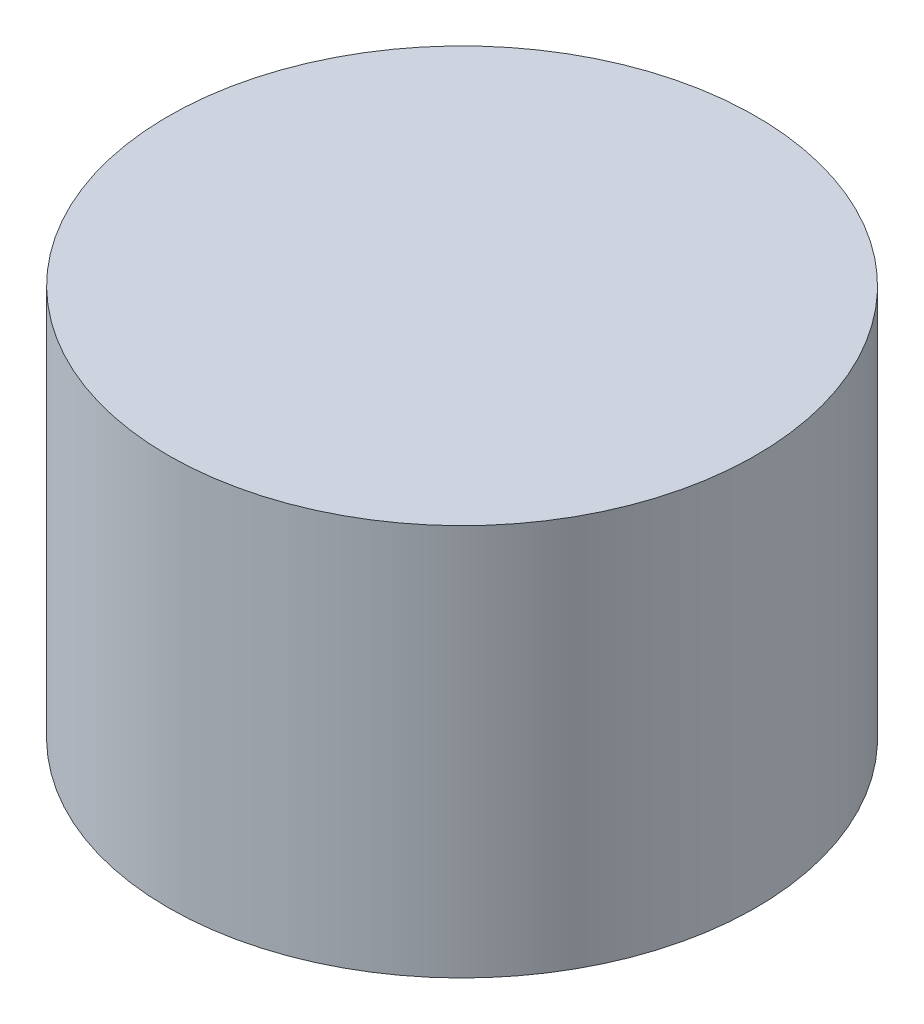
ISO-10303-21;
HEADER;
FILE_DESCRIPTION(('STEP AP214'),'2;1');
FILE_NAME('part.step','',(''),(''),'','','');
FILE_SCHEMA(('AUTOMOTIVE_DESIGN { 1 0 10303 214 1 1 1 1 }'));
ENDSEC;
DATA;
#1=APPLICATION_CONTEXT('core data for automotive mechanical design processes');
#2=APPLICATION_PROTOCOL_DEFINITION('international standard','automotive_design',2000,#1);
#3=PRODUCT_CONTEXT('',#1,'mechanical');
#4=PRODUCT('Part','Part','',(#3));
#5=PRODUCT_RELATED_PRODUCT_CATEGORY('part','',(#4));
#6=PRODUCT_DEFINITION_FORMATION('','',#4);
#7=PRODUCT_DEFINITION_CONTEXT('part definition',#1,'design');
#8=PRODUCT_DEFINITION('design','',#6,#7);
#9=PRODUCT_DEFINITION_SHAPE('','',#8);
#10=(LENGTH_UNIT() NAMED_UNIT(*) SI_UNIT(.MILLI.,.METRE.));
#11=(NAMED_UNIT(*) PLANE_ANGLE_UNIT() SI_UNIT($,.RADIAN.));
#12=(NAMED_UNIT(*) SI_UNIT($,.STERADIAN.) SOLID_ANGLE_UNIT());
#13=UNCERTAINTY_MEASURE_WITH_UNIT(LENGTH_MEASURE(1.E-05),#10,'distance_accuracy_value','');
#14=(GEOMETRIC_REPRESENTATION_CONTEXT(3) GLOBAL_UNCERTAINTY_ASSIGNED_CONTEXT((#13)) GLOBAL_UNIT_ASSIGNED_CONTEXT((#10,
#11,#12)) REPRESENTATION_CONTEXT('',''));
#15=CARTESIAN_POINT('',(0.,0.,0.));
#16=DIRECTION('',(0.,0.,1.));
#17=DIRECTION('',(1.,0.,0.));
#18=AXIS2_PLACEMENT_3D('',#15,#16,#17);
#19=CARTESIAN_POINT('',(0.,25.4,0.));
#20=DIRECTION('',(0.,-1.,0.));
#21=DIRECTION('',(0.,0.,-1.));
#22=AXIS2_PLACEMENT_3D('',#19,#20,#21);
#23=CYLINDRICAL_SURFACE('',#22,19.05);
#24=CARTESIAN_POINT('',(0.,25.4,0.));
#25=DIRECTION('',(0.,1.,0.));
#26=DIRECTION('',(0.,0.,1.));
#27=AXIS2_PLACEMENT_3D('',#24,#25,#26);
#28=CIRCLE('',#27,19.05);
#29=CARTESIAN_POINT('',(0.,25.4,19.05));
#30=VERTEX_POINT('',#29);
#31=EDGE_CURVE('E10',#30,#30,#28,.T.);
#32=ORIENTED_EDGE('',*,*,#31,.F.);
#33=EDGE_LOOP('',(#32));
#34=FACE_BOUND('',#33,.T.);
#35=CARTESIAN_POINT('',(0.,0.,0.));
#36=DIRECTION('',(0.,1.,0.));
#37=DIRECTION('',(0.,0.,1.));
#38=AXIS2_PLACEMENT_3D('',#35,#36,#37);
#39=CIRCLE('',#38,19.05);
#40=CARTESIAN_POINT('',(0.,0.,19.05));
#41=VERTEX_POINT('',#40);
#42=EDGE_CURVE('E46',#41,#41,#39,.T.);
#43=ORIENTED_EDGE('',*,*,#42,.T.);
#44=EDGE_LOOP('',(#43));
#45=FACE_BOUND('',#44,.T.);
#46=ADVANCED_FACE('F43',(#34,#45),#23,.T.);
#47=CARTESIAN_POINT('',(0.,25.4,0.));
#48=DIRECTION('',(0.,1.,0.));
#49=DIRECTION('',(0.,0.,1.));
#50=AXIS2_PLACEMENT_3D('',#47,#48,#49);
#51=PLANE('',#50);
#52=ORIENTED_EDGE('',*,*,#31,.T.);
#53=EDGE_LOOP('',(#52));
#54=FACE_BOUND('',#53,.T.);
#55=ADVANCED_FACE('F60',(#54),#51,.T.);
#56=CARTESIAN_POINT('',(0.,0.,0.));
#57=DIRECTION('',(0.,1.,0.));
#58=DIRECTION('',(0.,0.,1.));
#59=AXIS2_PLACEMENT_3D('',#56,#57,#58);
#60=PLANE('',#59);
#61=ORIENTED_EDGE('',*,*,#42,.F.);
#62=EDGE_LOOP('',(#61));
#63=FACE_BOUND('',#62,.T.);
#64=ADVANCED_FACE('F58',(#63),#60,.F.);
#65=CLOSED_SHELL('',(#46,#55,#64));
#66=MANIFOLD_SOLID_BREP('B2',#65);
#67=ADVANCED_BREP_SHAPE_REPRESENTATION('',(#18,#66),#14);
#68=SHAPE_DEFINITION_REPRESENTATION(#9,#67);
ENDSEC;
END-ISO-10303-21;
